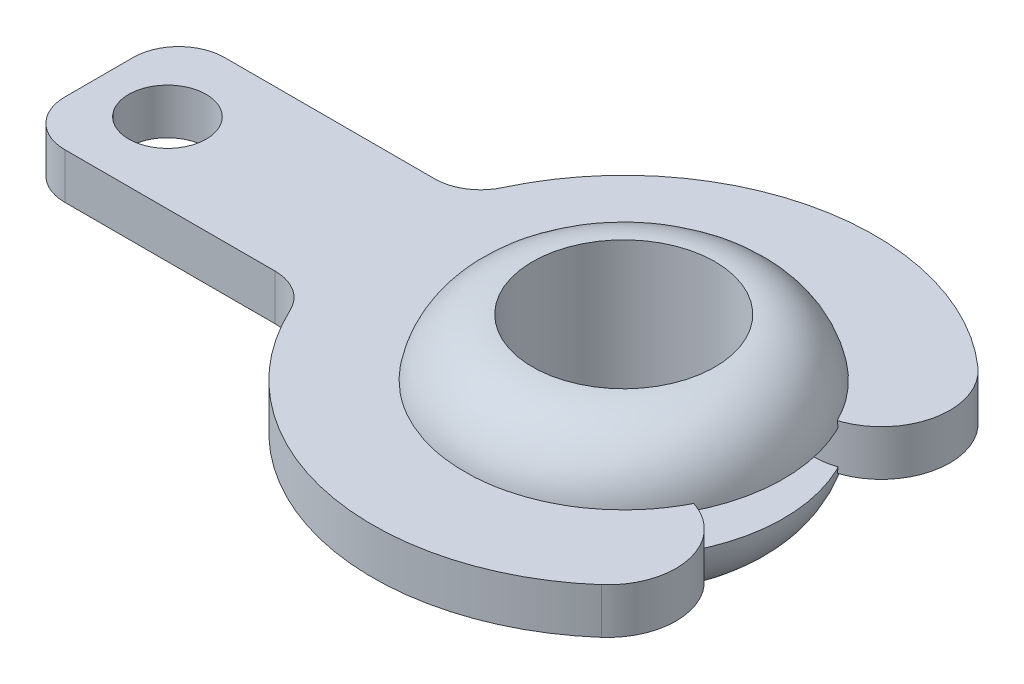
ISO-10303-21;
HEADER;
FILE_DESCRIPTION(('STEP AP214'),'2;1');
FILE_NAME('part.step','',(''),(''),'','','');
FILE_SCHEMA(('AUTOMOTIVE_DESIGN { 1 0 10303 214 1 1 1 1 }'));
ENDSEC;
DATA;
#1=APPLICATION_CONTEXT('core data for automotive mechanical design processes');
#2=APPLICATION_PROTOCOL_DEFINITION('international standard','automotive_design',2000,#1);
#3=PRODUCT_CONTEXT('',#1,'mechanical');
#4=PRODUCT('Part','Part','',(#3));
#5=PRODUCT_RELATED_PRODUCT_CATEGORY('part','',(#4));
#6=PRODUCT_DEFINITION_FORMATION('','',#4);
#7=PRODUCT_DEFINITION_CONTEXT('part definition',#1,'design');
#8=PRODUCT_DEFINITION('design','',#6,#7);
#9=PRODUCT_DEFINITION_SHAPE('','',#8);
#10=(LENGTH_UNIT() NAMED_UNIT(*) SI_UNIT(.MILLI.,.METRE.));
#11=(NAMED_UNIT(*) PLANE_ANGLE_UNIT() SI_UNIT($,.RADIAN.));
#12=(NAMED_UNIT(*) SI_UNIT($,.STERADIAN.) SOLID_ANGLE_UNIT());
#13=UNCERTAINTY_MEASURE_WITH_UNIT(LENGTH_MEASURE(1.E-05),#10,'distance_accuracy_value','');
#14=(GEOMETRIC_REPRESENTATION_CONTEXT(3) GLOBAL_UNCERTAINTY_ASSIGNED_CONTEXT((#13)) GLOBAL_UNIT_ASSIGNED_CONTEXT((#10,
#11,#12)) REPRESENTATION_CONTEXT('',''));
#15=CARTESIAN_POINT('',(0.,0.,0.));
#16=DIRECTION('',(0.,0.,1.));
#17=DIRECTION('',(1.,0.,0.));
#18=AXIS2_PLACEMENT_3D('',#15,#16,#17);
#19=CARTESIAN_POINT('',(0.,2.,3.5));
#20=DIRECTION('',(0.,0.,-1.));
#21=DIRECTION('',(-1.,0.,0.));
#22=AXIS2_PLACEMENT_3D('',#19,#20,#21);
#23=PLANE('',#22);
#24=DIRECTION('',(1.,0.,0.));
#25=VECTOR('',#24,1.);
#26=CARTESIAN_POINT('',(0.,0.,3.5));
#27=LINE('',#26,#25);
#28=CARTESIAN_POINT('',(-21.,0.,3.5));
#29=VERTEX_POINT('',#28);
#30=CARTESIAN_POINT('',(-11.7792189893897,0.,3.5));
#31=VERTEX_POINT('',#30);
#32=EDGE_CURVE('P0_E144',#29,#31,#27,.T.);
#33=ORIENTED_EDGE('',*,*,#32,.T.);
#34=DIRECTION('',(0.,1.,0.));
#35=VECTOR('',#34,1.);
#36=CARTESIAN_POINT('',(-11.7792189893897,2.,3.5));
#37=LINE('',#36,#35);
#38=CARTESIAN_POINT('',(-11.7792189893897,2.,3.5));
#39=VERTEX_POINT('',#38);
#40=EDGE_CURVE('P0_E194',#31,#39,#37,.T.);
#41=ORIENTED_EDGE('',*,*,#40,.T.);
#42=DIRECTION('',(1.,0.,0.));
#43=VECTOR('',#42,1.);
#44=CARTESIAN_POINT('',(0.,2.,3.5));
#45=LINE('',#44,#43);
#46=CARTESIAN_POINT('',(-21.,2.,3.5));
#47=VERTEX_POINT('',#46);
#48=EDGE_CURVE('P0_E114',#47,#39,#45,.T.);
#49=ORIENTED_EDGE('',*,*,#48,.F.);
#50=DIRECTION('',(0.,-1.,0.));
#51=VECTOR('',#50,1.);
#52=CARTESIAN_POINT('',(-21.,2.,3.5));
#53=LINE('',#52,#51);
#54=EDGE_CURVE('P0_E191',#47,#29,#53,.T.);
#55=ORIENTED_EDGE('',*,*,#54,.T.);
#56=EDGE_LOOP('',(#33,#41,#49,#55));
#57=FACE_BOUND('',#56,.T.);
#58=ADVANCED_FACE('P0_F16',(#57),#23,.F.);
#59=CARTESIAN_POINT('',(0.,2.,0.));
#60=DIRECTION('',(0.,-1.,0.));
#61=DIRECTION('',(0.,0.,-1.));
#62=AXIS2_PLACEMENT_3D('',#59,#60,#61);
#63=CYLINDRICAL_SURFACE('',#62,11.);
#64=CARTESIAN_POINT('',(0.,2.,0.));
#65=DIRECTION('',(0.,1.,0.));
#66=DIRECTION('',(0.,0.,1.));
#67=AXIS2_PLACEMENT_3D('',#64,#65,#66);
#68=CIRCLE('',#67,11.);
#69=CARTESIAN_POINT('',(-9.96703145256055,2.,4.65384615384615));
#70=VERTEX_POINT('',#69);
#71=CARTESIAN_POINT('',(7.27581610542762,2.,8.24999999999999));
#72=VERTEX_POINT('',#71);
#73=EDGE_CURVE('P0_E103',#70,#72,#68,.T.);
#74=ORIENTED_EDGE('',*,*,#73,.F.);
#75=DIRECTION('',(0.,-1.,0.));
#76=VECTOR('',#75,1.);
#77=CARTESIAN_POINT('',(-9.96703145256055,2.,4.65384615384615));
#78=LINE('',#77,#76);
#79=CARTESIAN_POINT('',(-9.96703145256055,0.,4.65384615384615));
#80=VERTEX_POINT('',#79);
#81=EDGE_CURVE('P0_E189',#70,#80,#78,.T.);
#82=ORIENTED_EDGE('',*,*,#81,.T.);
#83=CARTESIAN_POINT('',(0.,0.,0.));
#84=DIRECTION('',(0.,1.,0.));
#85=DIRECTION('',(0.,0.,1.));
#86=AXIS2_PLACEMENT_3D('',#83,#84,#85);
#87=CIRCLE('',#86,11.);
#88=CARTESIAN_POINT('',(7.27581610542762,0.,8.24999999999999));
#89=VERTEX_POINT('',#88);
#90=EDGE_CURVE('P0_E121',#80,#89,#87,.T.);
#91=ORIENTED_EDGE('',*,*,#90,.T.);
#92=DIRECTION('',(0.,-1.,0.));
#93=VECTOR('',#92,1.);
#94=CARTESIAN_POINT('',(7.27581610542762,2.,8.24999999999999));
#95=LINE('',#94,#93);
#96=EDGE_CURVE('P0_E118',#72,#89,#95,.T.);
#97=ORIENTED_EDGE('',*,*,#96,.F.);
#98=EDGE_LOOP('',(#74,#82,#91,#97));
#99=FACE_BOUND('',#98,.T.);
#100=ADVANCED_FACE('P0_F119',(#99),#63,.T.);
#101=CARTESIAN_POINT('',(5.29150262212918,2.,6.));
#102=DIRECTION('',(0.,-1.,0.));
#103=DIRECTION('',(0.,0.,-1.));
#104=AXIS2_PLACEMENT_3D('',#101,#102,#103);
#105=CYLINDRICAL_SURFACE('',#104,3.);
#106=CARTESIAN_POINT('',(5.29150262212918,0.,6.));
#107=DIRECTION('',(0.,1.,0.));
#108=DIRECTION('',(0.,0.,1.));
#109=AXIS2_PLACEMENT_3D('',#106,#107,#108);
#110=CIRCLE('',#109,3.);
#111=CARTESIAN_POINT('',(3.30718913883074,0.,3.75));
#112=VERTEX_POINT('',#111);
#113=EDGE_CURVE('P0_E149',#89,#112,#110,.T.);
#114=ORIENTED_EDGE('',*,*,#113,.T.);
#115=DIRECTION('',(0.,-1.,0.));
#116=VECTOR('',#115,1.);
#117=CARTESIAN_POINT('',(3.30718913883074,2.,3.75));
#118=LINE('',#117,#116);
#119=CARTESIAN_POINT('',(3.30718913883074,2.,3.75));
#120=VERTEX_POINT('',#119);
#121=EDGE_CURVE('P0_E126',#120,#112,#118,.T.);
#122=ORIENTED_EDGE('',*,*,#121,.F.);
#123=CARTESIAN_POINT('',(5.29150262212918,2.,6.));
#124=DIRECTION('',(0.,1.,0.));
#125=DIRECTION('',(0.,0.,1.));
#126=AXIS2_PLACEMENT_3D('',#123,#124,#125);
#127=CIRCLE('',#126,3.);
#128=EDGE_CURVE('P0_E109',#72,#120,#127,.T.);
#129=ORIENTED_EDGE('',*,*,#128,.F.);
#130=ORIENTED_EDGE('',*,*,#96,.T.);
#131=EDGE_LOOP('',(#114,#122,#129,#130));
#132=FACE_BOUND('',#131,.T.);
#133=ADVANCED_FACE('P0_F128',(#132),#105,.T.);
#134=CARTESIAN_POINT('',(0.,2.,0.));
#135=DIRECTION('',(0.,-1.,0.));
#136=DIRECTION('',(0.,0.,-1.));
#137=AXIS2_PLACEMENT_3D('',#134,#135,#136);
#138=CYLINDRICAL_SURFACE('',#137,5.);
#139=CARTESIAN_POINT('',(0.,0.,0.));
#140=DIRECTION('',(0.,1.,0.));
#141=DIRECTION('',(0.,0.,1.));
#142=AXIS2_PLACEMENT_3D('',#139,#140,#141);
#143=CIRCLE('',#142,5.);
#144=CARTESIAN_POINT('',(3.30718913883074,0.,-3.75));
#145=VERTEX_POINT('',#144);
#146=EDGE_CURVE('P0_E152',#145,#112,#143,.T.);
#147=ORIENTED_EDGE('',*,*,#146,.F.);
#148=DIRECTION('',(0.,-1.,0.));
#149=VECTOR('',#148,1.);
#150=CARTESIAN_POINT('',(3.30718913883074,2.,-3.75));
#151=LINE('',#150,#149);
#152=CARTESIAN_POINT('',(3.30718913883074,2.,-3.75));
#153=VERTEX_POINT('',#152);
#154=EDGE_CURVE('P0_E165',#153,#145,#151,.T.);
#155=ORIENTED_EDGE('',*,*,#154,.F.);
#156=CARTESIAN_POINT('',(0.,2.,0.));
#157=DIRECTION('',(0.,1.,0.));
#158=DIRECTION('',(0.,0.,1.));
#159=AXIS2_PLACEMENT_3D('',#156,#157,#158);
#160=CIRCLE('',#159,5.);
#161=EDGE_CURVE('P0_E130',#153,#120,#160,.T.);
#162=ORIENTED_EDGE('',*,*,#161,.T.);
#163=ORIENTED_EDGE('',*,*,#121,.T.);
#164=EDGE_LOOP('',(#147,#155,#162,#163));
#165=FACE_BOUND('',#164,.T.);
#166=ADVANCED_FACE('P0_F268',(#165),#138,.F.);
#167=CARTESIAN_POINT('',(5.29150262212918,2.,-6.));
#168=DIRECTION('',(0.,-1.,0.));
#169=DIRECTION('',(0.,0.,-1.));
#170=AXIS2_PLACEMENT_3D('',#167,#168,#169);
#171=CYLINDRICAL_SURFACE('',#170,3.);
#172=CARTESIAN_POINT('',(5.29150262212918,0.,-6.));
#173=DIRECTION('',(0.,1.,0.));
#174=DIRECTION('',(0.,0.,1.));
#175=AXIS2_PLACEMENT_3D('',#172,#173,#174);
#176=CIRCLE('',#175,3.);
#177=CARTESIAN_POINT('',(7.27581610542762,0.,-8.25));
#178=VERTEX_POINT('',#177);
#179=EDGE_CURVE('P0_E155',#145,#178,#176,.T.);
#180=ORIENTED_EDGE('',*,*,#179,.T.);
#181=DIRECTION('',(0.,-1.,0.));
#182=VECTOR('',#181,1.);
#183=CARTESIAN_POINT('',(7.27581610542762,2.,-8.25));
#184=LINE('',#183,#182);
#185=CARTESIAN_POINT('',(7.27581610542762,2.,-8.25));
#186=VERTEX_POINT('',#185);
#187=EDGE_CURVE('P0_E143',#186,#178,#184,.T.);
#188=ORIENTED_EDGE('',*,*,#187,.F.);
#189=CARTESIAN_POINT('',(5.29150262212918,2.,-6.));
#190=DIRECTION('',(0.,1.,0.));
#191=DIRECTION('',(0.,0.,1.));
#192=AXIS2_PLACEMENT_3D('',#189,#190,#191);
#193=CIRCLE('',#192,3.);
#194=EDGE_CURVE('P0_E132',#153,#186,#193,.T.);
#195=ORIENTED_EDGE('',*,*,#194,.F.);
#196=ORIENTED_EDGE('',*,*,#154,.T.);
#197=EDGE_LOOP('',(#180,#188,#195,#196));
#198=FACE_BOUND('',#197,.T.);
#199=ADVANCED_FACE('P0_F266',(#198),#171,.T.);
#200=CARTESIAN_POINT('',(-9.96703145256055,0.,-4.65384615384615));
#201=VERTEX_POINT('',#200);
#202=EDGE_CURVE('P0_E150',#178,#201,#87,.T.);
#203=ORIENTED_EDGE('',*,*,#202,.T.);
#204=DIRECTION('',(0.,-1.,0.));
#205=VECTOR('',#204,1.);
#206=CARTESIAN_POINT('',(-9.96703145256055,2.,-4.65384615384615));
#207=LINE('',#206,#205);
#208=CARTESIAN_POINT('',(-9.96703145256055,2.,-4.65384615384615));
#209=VERTEX_POINT('',#208);
#210=EDGE_CURVE('P0_E31',#201,#209,#207,.F.);
#211=ORIENTED_EDGE('',*,*,#210,.T.);
#212=EDGE_CURVE('P0_E116',#186,#209,#68,.T.);
#213=ORIENTED_EDGE('',*,*,#212,.F.);
#214=ORIENTED_EDGE('',*,*,#187,.T.);
#215=EDGE_LOOP('',(#203,#211,#213,#214));
#216=FACE_BOUND('',#215,.T.);
#217=ADVANCED_FACE('P0_F226',(#216),#63,.T.);
#218=CARTESIAN_POINT('',(0.,2.,-3.5));
#219=DIRECTION('',(0.,0.,-1.));
#220=DIRECTION('',(-1.,0.,0.));
#221=AXIS2_PLACEMENT_3D('',#218,#219,#220);
#222=PLANE('',#221);
#223=DIRECTION('',(1.,0.,0.));
#224=VECTOR('',#223,1.);
#225=CARTESIAN_POINT('',(0.,0.,-3.5));
#226=LINE('',#225,#224);
#227=CARTESIAN_POINT('',(-21.,0.,-3.5));
#228=VERTEX_POINT('',#227);
#229=CARTESIAN_POINT('',(-11.7792189893897,0.,-3.5));
#230=VERTEX_POINT('',#229);
#231=EDGE_CURVE('P0_E157',#228,#230,#226,.T.);
#232=ORIENTED_EDGE('',*,*,#231,.F.);
#233=DIRECTION('',(0.,-1.,0.));
#234=VECTOR('',#233,1.);
#235=CARTESIAN_POINT('',(-21.,2.,-3.5));
#236=LINE('',#235,#234);
#237=CARTESIAN_POINT('',(-21.,2.,-3.5));
#238=VERTEX_POINT('',#237);
#239=EDGE_CURVE('P0_E182',#228,#238,#236,.F.);
#240=ORIENTED_EDGE('',*,*,#239,.T.);
#241=DIRECTION('',(1.,0.,0.));
#242=VECTOR('',#241,1.);
#243=CARTESIAN_POINT('',(0.,2.,-3.5));
#244=LINE('',#243,#242);
#245=CARTESIAN_POINT('',(-11.7792189893897,2.,-3.5));
#246=VERTEX_POINT('',#245);
#247=EDGE_CURVE('P0_E137',#238,#246,#244,.T.);
#248=ORIENTED_EDGE('',*,*,#247,.T.);
#249=DIRECTION('',(0.,-1.,0.));
#250=VECTOR('',#249,1.);
#251=CARTESIAN_POINT('',(-11.7792189893897,2.,-3.5));
#252=LINE('',#251,#250);
#253=EDGE_CURVE('P0_E179',#246,#230,#252,.T.);
#254=ORIENTED_EDGE('',*,*,#253,.T.);
#255=EDGE_LOOP('',(#232,#240,#248,#254));
#256=FACE_BOUND('',#255,.T.);
#257=ADVANCED_FACE('P0_F259',(#256),#222,.T.);
#258=CARTESIAN_POINT('',(-23.,2.,0.));
#259=DIRECTION('',(1.,0.,0.));
#260=DIRECTION('',(0.,0.,-1.));
#261=AXIS2_PLACEMENT_3D('',#258,#259,#260);
#262=PLANE('',#261);
#263=DIRECTION('',(0.,0.,1.));
#264=VECTOR('',#263,1.);
#265=CARTESIAN_POINT('',(-23.,2.,0.));
#266=LINE('',#265,#264);
#267=CARTESIAN_POINT('',(-23.,2.,-1.5));
#268=VERTEX_POINT('',#267);
#269=CARTESIAN_POINT('',(-23.,2.,1.5));
#270=VERTEX_POINT('',#269);
#271=EDGE_CURVE('P0_E140',#268,#270,#266,.T.);
#272=ORIENTED_EDGE('',*,*,#271,.F.);
#273=DIRECTION('',(0.,-1.,0.));
#274=VECTOR('',#273,1.);
#275=CARTESIAN_POINT('',(-23.,0.,-1.5));
#276=LINE('',#275,#274);
#277=CARTESIAN_POINT('',(-23.,0.,-1.5));
#278=VERTEX_POINT('',#277);
#279=EDGE_CURVE('P0_E172',#268,#278,#276,.T.);
#280=ORIENTED_EDGE('',*,*,#279,.T.);
#281=DIRECTION('',(0.,0.,1.));
#282=VECTOR('',#281,1.);
#283=CARTESIAN_POINT('',(-23.,0.,0.));
#284=LINE('',#283,#282);
#285=CARTESIAN_POINT('',(-23.,0.,1.5));
#286=VERTEX_POINT('',#285);
#287=EDGE_CURVE('P0_E160',#278,#286,#284,.T.);
#288=ORIENTED_EDGE('',*,*,#287,.T.);
#289=DIRECTION('',(0.,-1.,0.));
#290=VECTOR('',#289,1.);
#291=CARTESIAN_POINT('',(-23.,2.,1.5));
#292=LINE('',#291,#290);
#293=EDGE_CURVE('P0_E125',#286,#270,#292,.F.);
#294=ORIENTED_EDGE('',*,*,#293,.T.);
#295=EDGE_LOOP('',(#272,#280,#288,#294));
#296=FACE_BOUND('',#295,.T.);
#297=ADVANCED_FACE('P0_F244',(#296),#262,.F.);
#298=CARTESIAN_POINT('',(0.,2.,0.));
#299=DIRECTION('',(0.,1.,0.));
#300=DIRECTION('',(0.,0.,1.));
#301=AXIS2_PLACEMENT_3D('',#298,#299,#300);
#302=PLANE('',#301);
#303=CARTESIAN_POINT('',(-20.,2.,0.));
#304=DIRECTION('',(0.,1.,0.));
#305=DIRECTION('',(0.,0.,1.));
#306=AXIS2_PLACEMENT_3D('',#303,#304,#305);
#307=CIRCLE('',#306,1.7);
#308=CARTESIAN_POINT('',(-20.,2.,1.7));
#309=VERTEX_POINT('',#308);
#310=EDGE_CURVE('P0_E170',#309,#309,#307,.T.);
#311=ORIENTED_EDGE('',*,*,#310,.F.);
#312=EDGE_LOOP('',(#311));
#313=FACE_BOUND('',#312,.T.);
#314=ORIENTED_EDGE('',*,*,#247,.F.);
#315=CARTESIAN_POINT('',(-21.,2.,-1.5));
#316=DIRECTION('',(0.,1.,0.));
#317=DIRECTION('',(0.,0.,1.));
#318=AXIS2_PLACEMENT_3D('',#315,#316,#317);
#319=CIRCLE('',#318,2.);
#320=EDGE_CURVE('P0_E186',#238,#268,#319,.T.);
#321=ORIENTED_EDGE('',*,*,#320,.T.);
#322=ORIENTED_EDGE('',*,*,#271,.T.);
#323=CARTESIAN_POINT('',(-21.,2.,1.5));
#324=DIRECTION('',(0.,1.,0.));
#325=DIRECTION('',(0.,0.,1.));
#326=AXIS2_PLACEMENT_3D('',#323,#324,#325);
#327=CIRCLE('',#326,2.);
#328=EDGE_CURVE('P0_E184',#270,#47,#327,.T.);
#329=ORIENTED_EDGE('',*,*,#328,.T.);
#330=ORIENTED_EDGE('',*,*,#48,.T.);
#331=CARTESIAN_POINT('',(-11.7792189893897,2.,5.5));
#332=DIRECTION('',(0.,1.,0.));
#333=DIRECTION('',(0.,0.,1.));
#334=AXIS2_PLACEMENT_3D('',#331,#332,#333);
#335=CIRCLE('',#334,2.);
#336=EDGE_CURVE('P0_E11',#39,#70,#335,.F.);
#337=ORIENTED_EDGE('',*,*,#336,.T.);
#338=ORIENTED_EDGE('',*,*,#73,.T.);
#339=ORIENTED_EDGE('',*,*,#128,.T.);
#340=ORIENTED_EDGE('',*,*,#161,.F.);
#341=ORIENTED_EDGE('',*,*,#194,.T.);
#342=ORIENTED_EDGE('',*,*,#212,.T.);
#343=CARTESIAN_POINT('',(-11.7792189893897,2.,-5.5));
#344=DIRECTION('',(0.,1.,0.));
#345=DIRECTION('',(0.,0.,1.));
#346=AXIS2_PLACEMENT_3D('',#343,#344,#345);
#347=CIRCLE('',#346,2.);
#348=EDGE_CURVE('P0_E198',#209,#246,#347,.F.);
#349=ORIENTED_EDGE('',*,*,#348,.T.);
#350=EDGE_LOOP('',(#314,#321,#322,#329,#330,#337,#338,#339,#340,#341,#342,#349));
#351=FACE_BOUND('',#350,.T.);
#352=ADVANCED_FACE('P0_F106',(#313,#351),#302,.T.);
#353=CARTESIAN_POINT('',(0.,0.,0.));
#354=DIRECTION('',(0.,1.,0.));
#355=DIRECTION('',(0.,0.,1.));
#356=AXIS2_PLACEMENT_3D('',#353,#354,#355);
#357=PLANE('',#356);
#358=CARTESIAN_POINT('',(-20.,0.,0.));
#359=DIRECTION('',(0.,1.,0.));
#360=DIRECTION('',(0.,0.,1.));
#361=AXIS2_PLACEMENT_3D('',#358,#359,#360);
#362=CIRCLE('',#361,1.69999999999999);
#363=CARTESIAN_POINT('',(-20.,0.,1.69999999999999));
#364=VERTEX_POINT('',#363);
#365=EDGE_CURVE('P0_E147',#364,#364,#362,.T.);
#366=ORIENTED_EDGE('',*,*,#365,.T.);
#367=EDGE_LOOP('',(#366));
#368=FACE_BOUND('',#367,.T.);
#369=ORIENTED_EDGE('',*,*,#287,.F.);
#370=CARTESIAN_POINT('',(-21.,0.,-1.5));
#371=DIRECTION('',(0.,1.,0.));
#372=DIRECTION('',(0.,0.,1.));
#373=AXIS2_PLACEMENT_3D('',#370,#371,#372);
#374=CIRCLE('',#373,2.);
#375=EDGE_CURVE('P0_E177',#278,#228,#374,.F.);
#376=ORIENTED_EDGE('',*,*,#375,.T.);
#377=ORIENTED_EDGE('',*,*,#231,.T.);
#378=CARTESIAN_POINT('',(-11.7792189893897,0.,-5.5));
#379=DIRECTION('',(0.,1.,0.));
#380=DIRECTION('',(0.,0.,1.));
#381=AXIS2_PLACEMENT_3D('',#378,#379,#380);
#382=CIRCLE('',#381,2.);
#383=EDGE_CURVE('P0_E196',#230,#201,#382,.T.);
#384=ORIENTED_EDGE('',*,*,#383,.T.);
#385=ORIENTED_EDGE('',*,*,#202,.F.);
#386=ORIENTED_EDGE('',*,*,#179,.F.);
#387=ORIENTED_EDGE('',*,*,#146,.T.);
#388=ORIENTED_EDGE('',*,*,#113,.F.);
#389=ORIENTED_EDGE('',*,*,#90,.F.);
#390=CARTESIAN_POINT('',(-11.7792189893897,0.,5.5));
#391=DIRECTION('',(0.,1.,0.));
#392=DIRECTION('',(0.,0.,1.));
#393=AXIS2_PLACEMENT_3D('',#390,#391,#392);
#394=CIRCLE('',#393,2.);
#395=EDGE_CURVE('P0_E24',#80,#31,#394,.T.);
#396=ORIENTED_EDGE('',*,*,#395,.T.);
#397=ORIENTED_EDGE('',*,*,#32,.F.);
#398=CARTESIAN_POINT('',(-21.,0.,1.5));
#399=DIRECTION('',(0.,1.,0.));
#400=DIRECTION('',(0.,0.,1.));
#401=AXIS2_PLACEMENT_3D('',#398,#399,#400);
#402=CIRCLE('',#401,2.);
#403=EDGE_CURVE('P0_E175',#29,#286,#402,.F.);
#404=ORIENTED_EDGE('',*,*,#403,.T.);
#405=EDGE_LOOP('',(#369,#376,#377,#384,#385,#386,#387,#388,#389,#396,#397,#404));
#406=FACE_BOUND('',#405,.T.);
#407=ADVANCED_FACE('P0_F202',(#368,#406),#357,.F.);
#408=CARTESIAN_POINT('',(-20.,2.,0.));
#409=DIRECTION('',(0.,1.,0.));
#410=DIRECTION('',(0.,0.,1.));
#411=AXIS2_PLACEMENT_3D('',#408,#409,#410);
#412=CYLINDRICAL_SURFACE('',#411,1.69999999999999);
#413=ORIENTED_EDGE('',*,*,#310,.T.);
#414=EDGE_LOOP('',(#413));
#415=FACE_BOUND('',#414,.T.);
#416=ORIENTED_EDGE('',*,*,#365,.F.);
#417=EDGE_LOOP('',(#416));
#418=FACE_BOUND('',#417,.T.);
#419=ADVANCED_FACE('P0_F231',(#415,#418),#412,.F.);
#420=CARTESIAN_POINT('',(-21.,2.,-1.5));
#421=DIRECTION('',(0.,1.,0.));
#422=DIRECTION('',(0.,0.,1.));
#423=AXIS2_PLACEMENT_3D('',#420,#421,#422);
#424=CYLINDRICAL_SURFACE('',#423,2.);
#425=ORIENTED_EDGE('',*,*,#320,.F.);
#426=ORIENTED_EDGE('',*,*,#239,.F.);
#427=ORIENTED_EDGE('',*,*,#375,.F.);
#428=ORIENTED_EDGE('',*,*,#279,.F.);
#429=EDGE_LOOP('',(#425,#426,#427,#428));
#430=FACE_BOUND('',#429,.T.);
#431=ADVANCED_FACE('P0_F217',(#430),#424,.T.);
#432=CARTESIAN_POINT('',(-11.7792189893897,2.,-5.5));
#433=DIRECTION('',(0.,-1.,0.));
#434=DIRECTION('',(0.,0.,-1.));
#435=AXIS2_PLACEMENT_3D('',#432,#433,#434);
#436=CYLINDRICAL_SURFACE('',#435,2.);
#437=ORIENTED_EDGE('',*,*,#348,.F.);
#438=ORIENTED_EDGE('',*,*,#210,.F.);
#439=ORIENTED_EDGE('',*,*,#383,.F.);
#440=ORIENTED_EDGE('',*,*,#253,.F.);
#441=EDGE_LOOP('',(#437,#438,#439,#440));
#442=FACE_BOUND('',#441,.T.);
#443=ADVANCED_FACE('P0_F210',(#442),#436,.F.);
#444=CARTESIAN_POINT('',(-11.7792189893897,2.,5.5));
#445=DIRECTION('',(0.,-1.,0.));
#446=DIRECTION('',(0.,0.,-1.));
#447=AXIS2_PLACEMENT_3D('',#444,#445,#446);
#448=CYLINDRICAL_SURFACE('',#447,2.);
#449=ORIENTED_EDGE('',*,*,#336,.F.);
#450=ORIENTED_EDGE('',*,*,#40,.F.);
#451=ORIENTED_EDGE('',*,*,#395,.F.);
#452=ORIENTED_EDGE('',*,*,#81,.F.);
#453=EDGE_LOOP('',(#449,#450,#451,#452));
#454=FACE_BOUND('',#453,.T.);
#455=ADVANCED_FACE('P0_F208',(#454),#448,.F.);
#456=CARTESIAN_POINT('',(-21.,2.,1.5));
#457=DIRECTION('',(0.,-1.,0.));
#458=DIRECTION('',(0.,0.,-1.));
#459=AXIS2_PLACEMENT_3D('',#456,#457,#458);
#460=CYLINDRICAL_SURFACE('',#459,2.);
#461=ORIENTED_EDGE('',*,*,#328,.F.);
#462=ORIENTED_EDGE('',*,*,#293,.F.);
#463=ORIENTED_EDGE('',*,*,#403,.F.);
#464=ORIENTED_EDGE('',*,*,#54,.F.);
#465=EDGE_LOOP('',(#461,#462,#463,#464));
#466=FACE_BOUND('',#465,.T.);
#467=ADVANCED_FACE('P0_F18',(#466),#460,.T.);
#468=CLOSED_SHELL('',(#58,#100,#133,#166,#199,#217,#257,#297,#352,#407,#419,#431,#443,#455,#467));
#469=MANIFOLD_SOLID_BREP('P0_B1',#468);
#470=CARTESIAN_POINT('',(0.,1.48863636363636,0.));
#471=DIRECTION('',(0.,-1.,0.));
#472=DIRECTION('',(0.,0.,-1.));
#473=AXIS2_PLACEMENT_3D('',#470,#471,#472);
#474=TOROIDAL_SURFACE('',#473,4.,3.01136363636364);
#475=CARTESIAN_POINT('',(0.,1.75,0.));
#476=DIRECTION('',(0.,-1.,0.));
#477=DIRECTION('',(0.,0.,-1.));
#478=AXIS2_PLACEMENT_3D('',#475,#476,#477);
#479=CIRCLE('',#478,7.);
#480=CARTESIAN_POINT('',(0.,1.75,-7.));
#481=VERTEX_POINT('',#480);
#482=EDGE_CURVE('P1_E35',#481,#481,#479,.T.);
#483=ORIENTED_EDGE('',*,*,#482,.F.);
#484=EDGE_LOOP('',(#483));
#485=FACE_BOUND('',#484,.T.);
#486=CARTESIAN_POINT('',(0.,4.5,0.));
#487=DIRECTION('',(0.,-1.,0.));
#488=DIRECTION('',(0.,0.,-1.));
#489=AXIS2_PLACEMENT_3D('',#486,#487,#488);
#490=CIRCLE('',#489,4.);
#491=CARTESIAN_POINT('',(0.,4.5,-4.));
#492=VERTEX_POINT('',#491);
#493=EDGE_CURVE('P1_E9',#492,#492,#490,.T.);
#494=ORIENTED_EDGE('',*,*,#493,.T.);
#495=EDGE_LOOP('',(#494));
#496=FACE_BOUND('',#495,.T.);
#497=ADVANCED_FACE('P1_F13',(#485,#496),#474,.T.);
#498=CARTESIAN_POINT('',(0.,1.,0.));
#499=DIRECTION('',(0.,-1.,0.));
#500=DIRECTION('',(0.,0.,-1.));
#501=AXIS2_PLACEMENT_3D('',#498,#499,#500);
#502=CYLINDRICAL_SURFACE('',#501,4.);
#503=ORIENTED_EDGE('',*,*,#493,.F.);
#504=EDGE_LOOP('',(#503));
#505=FACE_BOUND('',#504,.T.);
#506=CARTESIAN_POINT('',(0.,-2.5,0.));
#507=DIRECTION('',(0.,-1.,0.));
#508=DIRECTION('',(0.,0.,-1.));
#509=AXIS2_PLACEMENT_3D('',#506,#507,#508);
#510=CIRCLE('',#509,4.);
#511=CARTESIAN_POINT('',(0.,-2.5,-4.));
#512=VERTEX_POINT('',#511);
#513=EDGE_CURVE('P1_E19',#512,#512,#510,.T.);
#514=ORIENTED_EDGE('',*,*,#513,.T.);
#515=EDGE_LOOP('',(#514));
#516=FACE_BOUND('',#515,.T.);
#517=ADVANCED_FACE('P1_F42',(#505,#516),#502,.F.);
#518=CARTESIAN_POINT('',(0.,0.511363636363635,0.));
#519=DIRECTION('',(0.,-1.,0.));
#520=DIRECTION('',(0.,0.,-1.));
#521=AXIS2_PLACEMENT_3D('',#518,#519,#520);
#522=TOROIDAL_SURFACE('',#521,4.,3.01136363636364);
#523=ORIENTED_EDGE('',*,*,#513,.F.);
#524=EDGE_LOOP('',(#523));
#525=FACE_BOUND('',#524,.T.);
#526=CARTESIAN_POINT('',(0.,0.25,0.));
#527=DIRECTION('',(0.,-1.,0.));
#528=DIRECTION('',(0.,0.,-1.));
#529=AXIS2_PLACEMENT_3D('',#526,#527,#528);
#530=CIRCLE('',#529,7.);
#531=CARTESIAN_POINT('',(0.,0.25,-7.));
#532=VERTEX_POINT('',#531);
#533=EDGE_CURVE('P1_E23',#532,#532,#530,.T.);
#534=ORIENTED_EDGE('',*,*,#533,.T.);
#535=EDGE_LOOP('',(#534));
#536=FACE_BOUND('',#535,.T.);
#537=ADVANCED_FACE('P1_F47',(#525,#536),#522,.T.);
#538=CARTESIAN_POINT('',(-4.5,0.25,0.));
#539=DIRECTION('',(0.,-1.,0.));
#540=DIRECTION('',(0.,0.,-1.));
#541=AXIS2_PLACEMENT_3D('',#538,#539,#540);
#542=PLANE('',#541);
#543=ORIENTED_EDGE('',*,*,#533,.F.);
#544=EDGE_LOOP('',(#543));
#545=FACE_BOUND('',#544,.T.);
#546=CARTESIAN_POINT('',(0.,0.25,0.));
#547=DIRECTION('',(0.,-1.,0.));
#548=DIRECTION('',(0.,0.,-1.));
#549=AXIS2_PLACEMENT_3D('',#546,#547,#548);
#550=CIRCLE('',#549,4.5);
#551=CARTESIAN_POINT('',(0.,0.25,-4.5));
#552=VERTEX_POINT('',#551);
#553=EDGE_CURVE('P1_E27',#552,#552,#550,.T.);
#554=ORIENTED_EDGE('',*,*,#553,.T.);
#555=EDGE_LOOP('',(#554));
#556=FACE_BOUND('',#555,.T.);
#557=ADVANCED_FACE('P1_F52',(#545,#556),#542,.F.);
#558=CARTESIAN_POINT('',(0.,1.,0.));
#559=DIRECTION('',(0.,-1.,0.));
#560=DIRECTION('',(0.,0.,-1.));
#561=AXIS2_PLACEMENT_3D('',#558,#559,#560);
#562=CYLINDRICAL_SURFACE('',#561,4.5);
#563=ORIENTED_EDGE('',*,*,#553,.F.);
#564=EDGE_LOOP('',(#563));
#565=FACE_BOUND('',#564,.T.);
#566=CARTESIAN_POINT('',(0.,1.75,0.));
#567=DIRECTION('',(0.,-1.,0.));
#568=DIRECTION('',(0.,0.,-1.));
#569=AXIS2_PLACEMENT_3D('',#566,#567,#568);
#570=CIRCLE('',#569,4.5);
#571=CARTESIAN_POINT('',(0.,1.75,-4.5));
#572=VERTEX_POINT('',#571);
#573=EDGE_CURVE('P1_E32',#572,#572,#570,.T.);
#574=ORIENTED_EDGE('',*,*,#573,.T.);
#575=EDGE_LOOP('',(#574));
#576=FACE_BOUND('',#575,.T.);
#577=ADVANCED_FACE('P1_F58',(#565,#576),#562,.T.);
#578=CARTESIAN_POINT('',(-4.5,1.75,0.));
#579=DIRECTION('',(0.,1.,0.));
#580=DIRECTION('',(0.,0.,1.));
#581=AXIS2_PLACEMENT_3D('',#578,#579,#580);
#582=PLANE('',#581);
#583=ORIENTED_EDGE('',*,*,#573,.F.);
#584=EDGE_LOOP('',(#583));
#585=FACE_BOUND('',#584,.T.);
#586=ORIENTED_EDGE('',*,*,#482,.T.);
#587=EDGE_LOOP('',(#586));
#588=FACE_BOUND('',#587,.T.);
#589=ADVANCED_FACE('P1_F39',(#585,#588),#582,.F.);
#590=CLOSED_SHELL('',(#497,#517,#537,#557,#577,#589));
#591=MANIFOLD_SOLID_BREP('P1_B1',#590);
#592=ADVANCED_BREP_SHAPE_REPRESENTATION('',(#18,#469,#591),#14);
#593=SHAPE_DEFINITION_REPRESENTATION(#9,#592);
ENDSEC;
END-ISO-10303-21;
